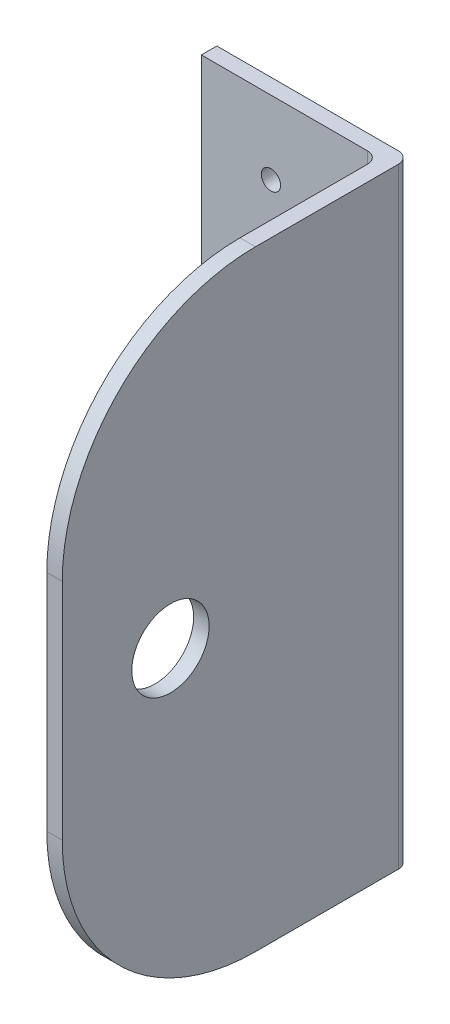
ISO-10303-21;
HEADER;
FILE_DESCRIPTION(('STEP AP214'),'2;1');
FILE_NAME('part.step','',(''),(''),'','','');
FILE_SCHEMA(('AUTOMOTIVE_DESIGN { 1 0 10303 214 1 1 1 1 }'));
ENDSEC;
DATA;
#1=APPLICATION_CONTEXT('core data for automotive mechanical design processes');
#2=APPLICATION_PROTOCOL_DEFINITION('international standard','automotive_design',2000,#1);
#3=PRODUCT_CONTEXT('',#1,'mechanical');
#4=PRODUCT('Part','Part','',(#3));
#5=PRODUCT_RELATED_PRODUCT_CATEGORY('part','',(#4));
#6=PRODUCT_DEFINITION_FORMATION('','',#4);
#7=PRODUCT_DEFINITION_CONTEXT('part definition',#1,'design');
#8=PRODUCT_DEFINITION('design','',#6,#7);
#9=PRODUCT_DEFINITION_SHAPE('','',#8);
#10=(LENGTH_UNIT() NAMED_UNIT(*) SI_UNIT(.MILLI.,.METRE.));
#11=(NAMED_UNIT(*) PLANE_ANGLE_UNIT() SI_UNIT($,.RADIAN.));
#12=(NAMED_UNIT(*) SI_UNIT($,.STERADIAN.) SOLID_ANGLE_UNIT());
#13=UNCERTAINTY_MEASURE_WITH_UNIT(LENGTH_MEASURE(1.E-05),#10,'distance_accuracy_value','');
#14=(GEOMETRIC_REPRESENTATION_CONTEXT(3) GLOBAL_UNCERTAINTY_ASSIGNED_CONTEXT((#13)) GLOBAL_UNIT_ASSIGNED_CONTEXT((#10,
#11,#12)) REPRESENTATION_CONTEXT('',''));
#15=CARTESIAN_POINT('',(0.,0.,0.));
#16=DIRECTION('',(0.,0.,1.));
#17=DIRECTION('',(1.,0.,0.));
#18=AXIS2_PLACEMENT_3D('',#15,#16,#17);
#19=CARTESIAN_POINT('',(0.,79.,0.));
#20=DIRECTION('',(0.,-1.,0.));
#21=DIRECTION('',(0.,0.,-1.));
#22=AXIS2_PLACEMENT_3D('',#19,#20,#21);
#23=PLANE('',#22);
#24=DIRECTION('',(0.,0.,-1.));
#25=VECTOR('',#24,1.);
#26=CARTESIAN_POINT('',(25.,79.,0.));
#27=LINE('',#26,#25);
#28=CARTESIAN_POINT('',(25.,79.,20.));
#29=VERTEX_POINT('',#28);
#30=CARTESIAN_POINT('',(25.,79.,1.5));
#31=VERTEX_POINT('',#30);
#32=EDGE_CURVE('E127',#29,#31,#27,.T.);
#33=ORIENTED_EDGE('',*,*,#32,.T.);
#34=CARTESIAN_POINT('',(23.5,79.,1.5));
#35=DIRECTION('',(0.,-1.,0.));
#36=DIRECTION('',(0.,0.,-1.));
#37=AXIS2_PLACEMENT_3D('',#34,#35,#36);
#38=CIRCLE('',#37,1.5);
#39=CARTESIAN_POINT('',(23.5,79.,0.));
#40=VERTEX_POINT('',#39);
#41=EDGE_CURVE('E163',#31,#40,#38,.F.);
#42=ORIENTED_EDGE('',*,*,#41,.T.);
#43=DIRECTION('',(-1.,0.,0.));
#44=VECTOR('',#43,1.);
#45=CARTESIAN_POINT('',(0.,79.,0.));
#46=LINE('',#45,#44);
#47=CARTESIAN_POINT('',(0.,79.,0.));
#48=VERTEX_POINT('',#47);
#49=EDGE_CURVE('E203',#40,#48,#46,.T.);
#50=ORIENTED_EDGE('',*,*,#49,.T.);
#51=DIRECTION('',(0.,0.,1.));
#52=VECTOR('',#51,1.);
#53=CARTESIAN_POINT('',(0.,79.,0.));
#54=LINE('',#53,#52);
#55=CARTESIAN_POINT('',(0.,79.,2.));
#56=VERTEX_POINT('',#55);
#57=EDGE_CURVE('E205',#48,#56,#54,.T.);
#58=ORIENTED_EDGE('',*,*,#57,.T.);
#59=DIRECTION('',(1.,0.,0.));
#60=VECTOR('',#59,1.);
#61=CARTESIAN_POINT('',(0.,79.,2.));
#62=LINE('',#61,#60);
#63=CARTESIAN_POINT('',(21.5,79.,2.));
#64=VERTEX_POINT('',#63);
#65=EDGE_CURVE('E207',#56,#64,#62,.T.);
#66=ORIENTED_EDGE('',*,*,#65,.T.);
#67=CARTESIAN_POINT('',(21.5,79.,3.5));
#68=DIRECTION('',(0.,-1.,0.));
#69=DIRECTION('',(0.,0.,-1.));
#70=AXIS2_PLACEMENT_3D('',#67,#68,#69);
#71=CIRCLE('',#70,1.5);
#72=CARTESIAN_POINT('',(23.,79.,3.5));
#73=VERTEX_POINT('',#72);
#74=EDGE_CURVE('E11',#64,#73,#71,.T.);
#75=ORIENTED_EDGE('',*,*,#74,.T.);
#76=DIRECTION('',(0.,0.,1.));
#77=VECTOR('',#76,1.);
#78=CARTESIAN_POINT('',(23.,79.,45.));
#79=LINE('',#78,#77);
#80=CARTESIAN_POINT('',(23.,79.,20.));
#81=VERTEX_POINT('',#80);
#82=EDGE_CURVE('E138',#73,#81,#79,.T.);
#83=ORIENTED_EDGE('',*,*,#82,.T.);
#84=DIRECTION('',(1.,0.,0.));
#85=VECTOR('',#84,1.);
#86=CARTESIAN_POINT('',(0.,79.,20.));
#87=LINE('',#86,#85);
#88=EDGE_CURVE('E151',#29,#81,#87,.F.);
#89=ORIENTED_EDGE('',*,*,#88,.F.);
#90=EDGE_LOOP('',(#33,#42,#50,#58,#66,#75,#83,#89));
#91=FACE_BOUND('',#90,.T.);
#92=ADVANCED_FACE('F32',(#91),#23,.F.);
#93=CARTESIAN_POINT('',(23.,79.,45.));
#94=DIRECTION('',(1.,0.,0.));
#95=DIRECTION('',(0.,0.,-1.));
#96=AXIS2_PLACEMENT_3D('',#93,#94,#95);
#97=PLANE('',#96);
#98=CARTESIAN_POINT('',(23.,39.5,31.));
#99=DIRECTION('',(1.,0.,0.));
#100=DIRECTION('',(0.,0.,-1.));
#101=AXIS2_PLACEMENT_3D('',#98,#99,#100);
#102=CIRCLE('',#101,5.);
#103=CARTESIAN_POINT('',(23.,39.5,26.));
#104=VERTEX_POINT('',#103);
#105=EDGE_CURVE('E199',#104,#104,#102,.T.);
#106=ORIENTED_EDGE('',*,*,#105,.T.);
#107=EDGE_LOOP('',(#106));
#108=FACE_BOUND('',#107,.T.);
#109=ORIENTED_EDGE('',*,*,#82,.F.);
#110=DIRECTION('',(0.,-1.,0.));
#111=VECTOR('',#110,1.);
#112=CARTESIAN_POINT('',(23.,0.,3.5));
#113=LINE('',#112,#111);
#114=CARTESIAN_POINT('',(23.,0.,3.5));
#115=VERTEX_POINT('',#114);
#116=EDGE_CURVE('E153',#73,#115,#113,.T.);
#117=ORIENTED_EDGE('',*,*,#116,.T.);
#118=DIRECTION('',(0.,0.,1.));
#119=VECTOR('',#118,1.);
#120=CARTESIAN_POINT('',(23.,0.,45.));
#121=LINE('',#120,#119);
#122=CARTESIAN_POINT('',(23.,0.,20.));
#123=VERTEX_POINT('',#122);
#124=EDGE_CURVE('E216',#115,#123,#121,.T.);
#125=ORIENTED_EDGE('',*,*,#124,.T.);
#126=CARTESIAN_POINT('',(23.,25.,20.));
#127=DIRECTION('',(1.,0.,0.));
#128=DIRECTION('',(0.,0.,-1.));
#129=AXIS2_PLACEMENT_3D('',#126,#127,#128);
#130=CIRCLE('',#129,25.);
#131=CARTESIAN_POINT('',(23.,25.,45.));
#132=VERTEX_POINT('',#131);
#133=EDGE_CURVE('E193',#132,#123,#130,.T.);
#134=ORIENTED_EDGE('',*,*,#133,.F.);
#135=DIRECTION('',(0.,-1.,0.));
#136=VECTOR('',#135,1.);
#137=CARTESIAN_POINT('',(23.,79.,45.));
#138=LINE('',#137,#136);
#139=CARTESIAN_POINT('',(23.,54.,45.));
#140=VERTEX_POINT('',#139);
#141=EDGE_CURVE('E134',#140,#132,#138,.T.);
#142=ORIENTED_EDGE('',*,*,#141,.F.);
#143=CARTESIAN_POINT('',(23.,54.,20.));
#144=DIRECTION('',(1.,0.,0.));
#145=DIRECTION('',(0.,0.,-1.));
#146=AXIS2_PLACEMENT_3D('',#143,#144,#145);
#147=CIRCLE('',#146,25.);
#148=EDGE_CURVE('E118',#140,#81,#147,.F.);
#149=ORIENTED_EDGE('',*,*,#148,.T.);
#150=EDGE_LOOP('',(#109,#117,#125,#134,#142,#149));
#151=FACE_BOUND('',#150,.T.);
#152=ADVANCED_FACE('F242',(#108,#151),#97,.F.);
#153=CARTESIAN_POINT('',(25.,79.,0.));
#154=DIRECTION('',(-1.,0.,0.));
#155=DIRECTION('',(0.,0.,1.));
#156=AXIS2_PLACEMENT_3D('',#153,#154,#155);
#157=PLANE('',#156);
#158=CARTESIAN_POINT('',(25.,39.5,31.));
#159=DIRECTION('',(1.,0.,0.));
#160=DIRECTION('',(0.,0.,-1.));
#161=AXIS2_PLACEMENT_3D('',#158,#159,#160);
#162=CIRCLE('',#161,5.);
#163=CARTESIAN_POINT('',(25.,39.5,26.));
#164=VERTEX_POINT('',#163);
#165=EDGE_CURVE('E196',#164,#164,#162,.T.);
#166=ORIENTED_EDGE('',*,*,#165,.F.);
#167=EDGE_LOOP('',(#166));
#168=FACE_BOUND('',#167,.T.);
#169=DIRECTION('',(0.,0.,-1.));
#170=VECTOR('',#169,1.);
#171=CARTESIAN_POINT('',(25.,0.,0.));
#172=LINE('',#171,#170);
#173=CARTESIAN_POINT('',(25.,0.,20.));
#174=VERTEX_POINT('',#173);
#175=CARTESIAN_POINT('',(25.,0.,1.5));
#176=VERTEX_POINT('',#175);
#177=EDGE_CURVE('E141',#174,#176,#172,.T.);
#178=ORIENTED_EDGE('',*,*,#177,.T.);
#179=DIRECTION('',(0.,-1.,0.));
#180=VECTOR('',#179,1.);
#181=CARTESIAN_POINT('',(25.,79.,1.5));
#182=LINE('',#181,#180);
#183=EDGE_CURVE('E49',#176,#31,#182,.F.);
#184=ORIENTED_EDGE('',*,*,#183,.T.);
#185=ORIENTED_EDGE('',*,*,#32,.F.);
#186=CARTESIAN_POINT('',(25.,54.,20.));
#187=DIRECTION('',(1.,0.,0.));
#188=DIRECTION('',(0.,0.,-1.));
#189=AXIS2_PLACEMENT_3D('',#186,#187,#188);
#190=CIRCLE('',#189,25.);
#191=CARTESIAN_POINT('',(25.,54.,45.));
#192=VERTEX_POINT('',#191);
#193=EDGE_CURVE('E115',#192,#29,#190,.F.);
#194=ORIENTED_EDGE('',*,*,#193,.F.);
#195=DIRECTION('',(0.,-1.,0.));
#196=VECTOR('',#195,1.);
#197=CARTESIAN_POINT('',(25.,79.,45.));
#198=LINE('',#197,#196);
#199=CARTESIAN_POINT('',(25.,25.,45.));
#200=VERTEX_POINT('',#199);
#201=EDGE_CURVE('E125',#192,#200,#198,.T.);
#202=ORIENTED_EDGE('',*,*,#201,.T.);
#203=CARTESIAN_POINT('',(25.,25.,20.));
#204=DIRECTION('',(1.,0.,0.));
#205=DIRECTION('',(0.,0.,-1.));
#206=AXIS2_PLACEMENT_3D('',#203,#204,#205);
#207=CIRCLE('',#206,25.);
#208=EDGE_CURVE('E190',#200,#174,#207,.T.);
#209=ORIENTED_EDGE('',*,*,#208,.T.);
#210=EDGE_LOOP('',(#178,#184,#185,#194,#202,#209));
#211=FACE_BOUND('',#210,.T.);
#212=ADVANCED_FACE('F123',(#168,#211),#157,.F.);
#213=CARTESIAN_POINT('',(0.,79.,0.));
#214=DIRECTION('',(0.,0.,1.));
#215=DIRECTION('',(1.,0.,0.));
#216=AXIS2_PLACEMENT_3D('',#213,#214,#215);
#217=PLANE('',#216);
#218=CARTESIAN_POINT('',(18.,9.5,0.));
#219=DIRECTION('',(0.,0.,-1.));
#220=DIRECTION('',(-1.,0.,0.));
#221=AXIS2_PLACEMENT_3D('',#218,#219,#220);
#222=CIRCLE('',#221,1.25);
#223=CARTESIAN_POINT('',(16.75,9.5,0.));
#224=VERTEX_POINT('',#223);
#225=EDGE_CURVE('E184',#224,#224,#222,.T.);
#226=ORIENTED_EDGE('',*,*,#225,.F.);
#227=EDGE_LOOP('',(#226));
#228=FACE_BOUND('',#227,.T.);
#229=CARTESIAN_POINT('',(9.,9.5,0.));
#230=DIRECTION('',(0.,0.,-1.));
#231=DIRECTION('',(-1.,0.,0.));
#232=AXIS2_PLACEMENT_3D('',#229,#230,#231);
#233=CIRCLE('',#232,1.25);
#234=CARTESIAN_POINT('',(7.75,9.5,0.));
#235=VERTEX_POINT('',#234);
#236=EDGE_CURVE('E174',#235,#235,#233,.T.);
#237=ORIENTED_EDGE('',*,*,#236,.F.);
#238=EDGE_LOOP('',(#237));
#239=FACE_BOUND('',#238,.T.);
#240=CARTESIAN_POINT('',(9.,69.5,0.));
#241=DIRECTION('',(0.,0.,-1.));
#242=DIRECTION('',(-1.,0.,0.));
#243=AXIS2_PLACEMENT_3D('',#240,#241,#242);
#244=CIRCLE('',#243,1.25);
#245=CARTESIAN_POINT('',(7.75,69.5,0.));
#246=VERTEX_POINT('',#245);
#247=EDGE_CURVE('E171',#246,#246,#244,.T.);
#248=ORIENTED_EDGE('',*,*,#247,.F.);
#249=EDGE_LOOP('',(#248));
#250=FACE_BOUND('',#249,.T.);
#251=CARTESIAN_POINT('',(18.,69.5,0.));
#252=DIRECTION('',(0.,0.,-1.));
#253=DIRECTION('',(-1.,0.,0.));
#254=AXIS2_PLACEMENT_3D('',#251,#252,#253);
#255=CIRCLE('',#254,1.25);
#256=CARTESIAN_POINT('',(16.75,69.5,0.));
#257=VERTEX_POINT('',#256);
#258=EDGE_CURVE('E168',#257,#257,#255,.T.);
#259=ORIENTED_EDGE('',*,*,#258,.F.);
#260=EDGE_LOOP('',(#259));
#261=FACE_BOUND('',#260,.T.);
#262=ORIENTED_EDGE('',*,*,#49,.F.);
#263=DIRECTION('',(0.,-1.,0.));
#264=VECTOR('',#263,1.);
#265=CARTESIAN_POINT('',(23.5,79.,0.));
#266=LINE('',#265,#264);
#267=CARTESIAN_POINT('',(23.5,0.,0.));
#268=VERTEX_POINT('',#267);
#269=EDGE_CURVE('E158',#40,#268,#266,.T.);
#270=ORIENTED_EDGE('',*,*,#269,.T.);
#271=DIRECTION('',(-1.,0.,0.));
#272=VECTOR('',#271,1.);
#273=CARTESIAN_POINT('',(0.,0.,0.));
#274=LINE('',#273,#272);
#275=CARTESIAN_POINT('',(0.,0.,0.));
#276=VERTEX_POINT('',#275);
#277=EDGE_CURVE('E202',#268,#276,#274,.T.);
#278=ORIENTED_EDGE('',*,*,#277,.T.);
#279=DIRECTION('',(0.,-1.,0.));
#280=VECTOR('',#279,1.);
#281=CARTESIAN_POINT('',(0.,79.,0.));
#282=LINE('',#281,#280);
#283=EDGE_CURVE('E146',#48,#276,#282,.T.);
#284=ORIENTED_EDGE('',*,*,#283,.F.);
#285=EDGE_LOOP('',(#262,#270,#278,#284));
#286=FACE_BOUND('',#285,.T.);
#287=ADVANCED_FACE('F229',(#228,#239,#250,#261,#286),#217,.F.);
#288=CARTESIAN_POINT('',(0.,79.,0.));
#289=DIRECTION('',(1.,0.,0.));
#290=DIRECTION('',(0.,0.,-1.));
#291=AXIS2_PLACEMENT_3D('',#288,#289,#290);
#292=PLANE('',#291);
#293=DIRECTION('',(0.,0.,1.));
#294=VECTOR('',#293,1.);
#295=CARTESIAN_POINT('',(0.,0.,0.));
#296=LINE('',#295,#294);
#297=CARTESIAN_POINT('',(0.,0.,2.));
#298=VERTEX_POINT('',#297);
#299=EDGE_CURVE('E212',#276,#298,#296,.T.);
#300=ORIENTED_EDGE('',*,*,#299,.T.);
#301=DIRECTION('',(0.,-1.,0.));
#302=VECTOR('',#301,1.);
#303=CARTESIAN_POINT('',(0.,79.,2.));
#304=LINE('',#303,#302);
#305=EDGE_CURVE('E136',#56,#298,#304,.T.);
#306=ORIENTED_EDGE('',*,*,#305,.F.);
#307=ORIENTED_EDGE('',*,*,#57,.F.);
#308=ORIENTED_EDGE('',*,*,#283,.T.);
#309=EDGE_LOOP('',(#300,#306,#307,#308));
#310=FACE_BOUND('',#309,.T.);
#311=ADVANCED_FACE('F232',(#310),#292,.F.);
#312=CARTESIAN_POINT('',(0.,79.,2.));
#313=DIRECTION('',(0.,0.,-1.));
#314=DIRECTION('',(-1.,0.,0.));
#315=AXIS2_PLACEMENT_3D('',#312,#313,#314);
#316=PLANE('',#315);
#317=CARTESIAN_POINT('',(18.,9.5,2.));
#318=DIRECTION('',(0.,0.,-1.));
#319=DIRECTION('',(-1.,0.,0.));
#320=AXIS2_PLACEMENT_3D('',#317,#318,#319);
#321=CIRCLE('',#320,1.25);
#322=CARTESIAN_POINT('',(16.75,9.5,2.00000000000001));
#323=VERTEX_POINT('',#322);
#324=EDGE_CURVE('E36',#323,#323,#321,.T.);
#325=ORIENTED_EDGE('',*,*,#324,.T.);
#326=EDGE_LOOP('',(#325));
#327=FACE_BOUND('',#326,.T.);
#328=CARTESIAN_POINT('',(9.,9.5,2.));
#329=DIRECTION('',(0.,0.,-1.));
#330=DIRECTION('',(-1.,0.,0.));
#331=AXIS2_PLACEMENT_3D('',#328,#329,#330);
#332=CIRCLE('',#331,1.25);
#333=CARTESIAN_POINT('',(7.75,9.5,2.00000000000001));
#334=VERTEX_POINT('',#333);
#335=EDGE_CURVE('E172',#334,#334,#332,.T.);
#336=ORIENTED_EDGE('',*,*,#335,.T.);
#337=EDGE_LOOP('',(#336));
#338=FACE_BOUND('',#337,.T.);
#339=CARTESIAN_POINT('',(9.,69.5,2.));
#340=DIRECTION('',(0.,0.,-1.));
#341=DIRECTION('',(-1.,0.,0.));
#342=AXIS2_PLACEMENT_3D('',#339,#340,#341);
#343=CIRCLE('',#342,1.25);
#344=CARTESIAN_POINT('',(7.75,69.5,2.00000000000001));
#345=VERTEX_POINT('',#344);
#346=EDGE_CURVE('E169',#345,#345,#343,.T.);
#347=ORIENTED_EDGE('',*,*,#346,.T.);
#348=EDGE_LOOP('',(#347));
#349=FACE_BOUND('',#348,.T.);
#350=CARTESIAN_POINT('',(18.,69.5,2.));
#351=DIRECTION('',(0.,0.,-1.));
#352=DIRECTION('',(-1.,0.,0.));
#353=AXIS2_PLACEMENT_3D('',#350,#351,#352);
#354=CIRCLE('',#353,1.25);
#355=CARTESIAN_POINT('',(16.75,69.5,2.00000000000001));
#356=VERTEX_POINT('',#355);
#357=EDGE_CURVE('E128',#356,#356,#354,.T.);
#358=ORIENTED_EDGE('',*,*,#357,.T.);
#359=EDGE_LOOP('',(#358));
#360=FACE_BOUND('',#359,.T.);
#361=DIRECTION('',(1.,0.,0.));
#362=VECTOR('',#361,1.);
#363=CARTESIAN_POINT('',(0.,0.,2.));
#364=LINE('',#363,#362);
#365=CARTESIAN_POINT('',(21.5,0.,2.));
#366=VERTEX_POINT('',#365);
#367=EDGE_CURVE('E214',#298,#366,#364,.T.);
#368=ORIENTED_EDGE('',*,*,#367,.T.);
#369=DIRECTION('',(0.,-1.,0.));
#370=VECTOR('',#369,1.);
#371=CARTESIAN_POINT('',(21.5,79.,2.));
#372=LINE('',#371,#370);
#373=EDGE_CURVE('E156',#366,#64,#372,.F.);
#374=ORIENTED_EDGE('',*,*,#373,.T.);
#375=ORIENTED_EDGE('',*,*,#65,.F.);
#376=ORIENTED_EDGE('',*,*,#305,.T.);
#377=EDGE_LOOP('',(#368,#374,#375,#376));
#378=FACE_BOUND('',#377,.T.);
#379=ADVANCED_FACE('F271',(#327,#338,#349,#360,#378),#316,.F.);
#380=CARTESIAN_POINT('',(25.,79.,45.));
#381=DIRECTION('',(0.,0.,-1.));
#382=DIRECTION('',(-1.,0.,0.));
#383=AXIS2_PLACEMENT_3D('',#380,#381,#382);
#384=PLANE('',#383);
#385=ORIENTED_EDGE('',*,*,#201,.F.);
#386=DIRECTION('',(1.,0.,0.));
#387=VECTOR('',#386,1.);
#388=CARTESIAN_POINT('',(0.,54.,45.));
#389=LINE('',#388,#387);
#390=EDGE_CURVE('E111',#140,#192,#389,.T.);
#391=ORIENTED_EDGE('',*,*,#390,.F.);
#392=ORIENTED_EDGE('',*,*,#141,.T.);
#393=DIRECTION('',(1.,0.,0.));
#394=VECTOR('',#393,1.);
#395=CARTESIAN_POINT('',(0.,25.,45.));
#396=LINE('',#395,#394);
#397=EDGE_CURVE('E133',#132,#200,#396,.T.);
#398=ORIENTED_EDGE('',*,*,#397,.T.);
#399=EDGE_LOOP('',(#385,#391,#392,#398));
#400=FACE_BOUND('',#399,.T.);
#401=ADVANCED_FACE('F131',(#400),#384,.F.);
#402=CARTESIAN_POINT('',(0.,0.,0.));
#403=DIRECTION('',(0.,-1.,0.));
#404=DIRECTION('',(0.,0.,-1.));
#405=AXIS2_PLACEMENT_3D('',#402,#403,#404);
#406=PLANE('',#405);
#407=ORIENTED_EDGE('',*,*,#277,.F.);
#408=CARTESIAN_POINT('',(23.5,0.,1.5));
#409=DIRECTION('',(0.,-1.,0.));
#410=DIRECTION('',(0.,0.,-1.));
#411=AXIS2_PLACEMENT_3D('',#408,#409,#410);
#412=CIRCLE('',#411,1.5);
#413=EDGE_CURVE('E57',#268,#176,#412,.T.);
#414=ORIENTED_EDGE('',*,*,#413,.T.);
#415=ORIENTED_EDGE('',*,*,#177,.F.);
#416=DIRECTION('',(1.,0.,0.));
#417=VECTOR('',#416,1.);
#418=CARTESIAN_POINT('',(0.,0.,20.));
#419=LINE('',#418,#417);
#420=EDGE_CURVE('E149',#123,#174,#419,.T.);
#421=ORIENTED_EDGE('',*,*,#420,.F.);
#422=ORIENTED_EDGE('',*,*,#124,.F.);
#423=CARTESIAN_POINT('',(21.5,0.,3.5));
#424=DIRECTION('',(0.,-1.,0.));
#425=DIRECTION('',(0.,0.,-1.));
#426=AXIS2_PLACEMENT_3D('',#423,#424,#425);
#427=CIRCLE('',#426,1.5);
#428=EDGE_CURVE('E41',#115,#366,#427,.F.);
#429=ORIENTED_EDGE('',*,*,#428,.T.);
#430=ORIENTED_EDGE('',*,*,#367,.F.);
#431=ORIENTED_EDGE('',*,*,#299,.F.);
#432=EDGE_LOOP('',(#407,#414,#415,#421,#422,#429,#430,#431));
#433=FACE_BOUND('',#432,.T.);
#434=ADVANCED_FACE('F243',(#433),#406,.T.);
#435=CARTESIAN_POINT('',(0.,39.5,31.));
#436=DIRECTION('',(1.,0.,0.));
#437=DIRECTION('',(0.,0.,-1.));
#438=AXIS2_PLACEMENT_3D('',#435,#436,#437);
#439=CYLINDRICAL_SURFACE('',#438,5.);
#440=ORIENTED_EDGE('',*,*,#165,.T.);
#441=EDGE_LOOP('',(#440));
#442=FACE_BOUND('',#441,.T.);
#443=ORIENTED_EDGE('',*,*,#105,.F.);
#444=EDGE_LOOP('',(#443));
#445=FACE_BOUND('',#444,.T.);
#446=ADVANCED_FACE('F248',(#442,#445),#439,.F.);
#447=CARTESIAN_POINT('',(0.,25.,20.));
#448=DIRECTION('',(1.,0.,0.));
#449=DIRECTION('',(0.,0.,-1.));
#450=AXIS2_PLACEMENT_3D('',#447,#448,#449);
#451=CYLINDRICAL_SURFACE('',#450,25.);
#452=ORIENTED_EDGE('',*,*,#133,.T.);
#453=ORIENTED_EDGE('',*,*,#420,.T.);
#454=ORIENTED_EDGE('',*,*,#208,.F.);
#455=ORIENTED_EDGE('',*,*,#397,.F.);
#456=EDGE_LOOP('',(#452,#453,#454,#455));
#457=FACE_BOUND('',#456,.T.);
#458=ADVANCED_FACE('F246',(#457),#451,.T.);
#459=CARTESIAN_POINT('',(0.,54.,20.));
#460=DIRECTION('',(1.,0.,0.));
#461=DIRECTION('',(0.,0.,-1.));
#462=AXIS2_PLACEMENT_3D('',#459,#460,#461);
#463=CYLINDRICAL_SURFACE('',#462,25.);
#464=ORIENTED_EDGE('',*,*,#390,.T.);
#465=ORIENTED_EDGE('',*,*,#193,.T.);
#466=ORIENTED_EDGE('',*,*,#88,.T.);
#467=ORIENTED_EDGE('',*,*,#148,.F.);
#468=EDGE_LOOP('',(#464,#465,#466,#467));
#469=FACE_BOUND('',#468,.T.);
#470=ADVANCED_FACE('F113',(#469),#463,.T.);
#471=CARTESIAN_POINT('',(21.5,79.,3.5));
#472=DIRECTION('',(0.,1.,0.));
#473=DIRECTION('',(0.,0.,1.));
#474=AXIS2_PLACEMENT_3D('',#471,#472,#473);
#475=CYLINDRICAL_SURFACE('',#474,1.5);
#476=ORIENTED_EDGE('',*,*,#74,.F.);
#477=ORIENTED_EDGE('',*,*,#373,.F.);
#478=ORIENTED_EDGE('',*,*,#428,.F.);
#479=ORIENTED_EDGE('',*,*,#116,.F.);
#480=EDGE_LOOP('',(#476,#477,#478,#479));
#481=FACE_BOUND('',#480,.T.);
#482=ADVANCED_FACE('F241',(#481),#475,.F.);
#483=CARTESIAN_POINT('',(23.5,79.,1.5));
#484=DIRECTION('',(0.,-1.,0.));
#485=DIRECTION('',(0.,0.,-1.));
#486=AXIS2_PLACEMENT_3D('',#483,#484,#485);
#487=CYLINDRICAL_SURFACE('',#486,1.5);
#488=ORIENTED_EDGE('',*,*,#41,.F.);
#489=ORIENTED_EDGE('',*,*,#183,.F.);
#490=ORIENTED_EDGE('',*,*,#413,.F.);
#491=ORIENTED_EDGE('',*,*,#269,.F.);
#492=EDGE_LOOP('',(#488,#489,#490,#491));
#493=FACE_BOUND('',#492,.T.);
#494=ADVANCED_FACE('F34',(#493),#487,.T.);
#495=CARTESIAN_POINT('',(18.,69.5,45.));
#496=DIRECTION('',(0.,0.,-1.));
#497=DIRECTION('',(-1.,0.,0.));
#498=AXIS2_PLACEMENT_3D('',#495,#496,#497);
#499=CYLINDRICAL_SURFACE('',#498,1.25);
#500=CARTESIAN_POINT('',(16.75,69.5,0.));
#501=CARTESIAN_POINT('',(16.75,69.5,0.0208333333333403));
#502=CARTESIAN_POINT('',(16.75,69.5,0.0416666666666736));
#503=CARTESIAN_POINT('',(16.75,69.5,0.0833333333333404));
#504=CARTESIAN_POINT('',(16.75,69.5,0.104166666666674));
#505=CARTESIAN_POINT('',(16.75,69.5,0.14583333333334));
#506=CARTESIAN_POINT('',(16.75,69.5,0.166666666666674));
#507=CARTESIAN_POINT('',(16.75,69.5,0.20833333333334));
#508=CARTESIAN_POINT('',(16.75,69.5,0.229166666666674));
#509=CARTESIAN_POINT('',(16.75,69.5,0.270833333333341));
#510=CARTESIAN_POINT('',(16.75,69.5,0.291666666666674));
#511=CARTESIAN_POINT('',(16.75,69.5,0.333333333333341));
#512=CARTESIAN_POINT('',(16.75,69.5,0.354166666666674));
#513=CARTESIAN_POINT('',(16.75,69.5,0.395833333333341));
#514=CARTESIAN_POINT('',(16.75,69.5,0.416666666666674));
#515=CARTESIAN_POINT('',(16.75,69.5,0.458333333333341));
#516=CARTESIAN_POINT('',(16.75,69.5,0.479166666666674));
#517=CARTESIAN_POINT('',(16.75,69.5,0.520833333333341));
#518=CARTESIAN_POINT('',(16.75,69.5,0.541666666666674));
#519=CARTESIAN_POINT('',(16.75,69.5,0.583333333333341));
#520=CARTESIAN_POINT('',(16.75,69.5,0.604166666666674));
#521=CARTESIAN_POINT('',(16.75,69.5,0.645833333333341));
#522=CARTESIAN_POINT('',(16.75,69.5,0.666666666666674));
#523=CARTESIAN_POINT('',(16.75,69.5,0.708333333333341));
#524=CARTESIAN_POINT('',(16.75,69.5,0.729166666666674));
#525=CARTESIAN_POINT('',(16.75,69.5,0.770833333333341));
#526=CARTESIAN_POINT('',(16.75,69.5,0.791666666666674));
#527=CARTESIAN_POINT('',(16.75,69.5,0.833333333333341));
#528=CARTESIAN_POINT('',(16.75,69.5,0.854166666666674));
#529=CARTESIAN_POINT('',(16.75,69.5,0.895833333333341));
#530=CARTESIAN_POINT('',(16.75,69.5,0.916666666666674));
#531=CARTESIAN_POINT('',(16.75,69.5,0.958333333333341));
#532=CARTESIAN_POINT('',(16.75,69.5,0.979166666666674));
#533=CARTESIAN_POINT('',(16.75,69.5,1.02083333333334));
#534=CARTESIAN_POINT('',(16.75,69.5,1.04166666666667));
#535=CARTESIAN_POINT('',(16.75,69.5,1.08333333333334));
#536=CARTESIAN_POINT('',(16.75,69.5,1.10416666666667));
#537=CARTESIAN_POINT('',(16.75,69.5,1.14583333333334));
#538=CARTESIAN_POINT('',(16.75,69.5,1.16666666666667));
#539=CARTESIAN_POINT('',(16.75,69.5,1.20833333333334));
#540=CARTESIAN_POINT('',(16.75,69.5,1.22916666666667));
#541=CARTESIAN_POINT('',(16.75,69.5,1.27083333333334));
#542=CARTESIAN_POINT('',(16.75,69.5,1.29166666666667));
#543=CARTESIAN_POINT('',(16.75,69.5,1.33333333333334));
#544=CARTESIAN_POINT('',(16.75,69.5,1.35416666666667));
#545=CARTESIAN_POINT('',(16.75,69.5,1.39583333333334));
#546=CARTESIAN_POINT('',(16.75,69.5,1.41666666666667));
#547=CARTESIAN_POINT('',(16.75,69.5,1.45833333333334));
#548=CARTESIAN_POINT('',(16.75,69.5,1.47916666666667));
#549=CARTESIAN_POINT('',(16.75,69.5,1.52083333333334));
#550=CARTESIAN_POINT('',(16.75,69.5,1.54166666666667));
#551=CARTESIAN_POINT('',(16.75,69.5,1.58333333333334));
#552=CARTESIAN_POINT('',(16.75,69.5,1.60416666666667));
#553=CARTESIAN_POINT('',(16.75,69.5,1.64583333333334));
#554=CARTESIAN_POINT('',(16.75,69.5,1.66666666666667));
#555=CARTESIAN_POINT('',(16.75,69.5,1.70833333333334));
#556=CARTESIAN_POINT('',(16.75,69.5,1.72916666666668));
#557=CARTESIAN_POINT('',(16.75,69.5,1.77083333333334));
#558=CARTESIAN_POINT('',(16.75,69.5,1.79166666666668));
#559=CARTESIAN_POINT('',(16.75,69.5,1.83333333333334));
#560=CARTESIAN_POINT('',(16.75,69.5,1.85416666666668));
#561=CARTESIAN_POINT('',(16.75,69.5,1.89583333333334));
#562=CARTESIAN_POINT('',(16.75,69.5,1.91666666666668));
#563=CARTESIAN_POINT('',(16.75,69.5,1.95833333333334));
#564=CARTESIAN_POINT('',(16.75,69.5,1.97916666666668));
#565=CARTESIAN_POINT('',(16.75,69.5,2.00000000000001));
#566=B_SPLINE_CURVE_WITH_KNOTS('',3,(#500,#501,#502,#503,#504,#505,#506,#507,#508,#509,#510,
#511,#512,#513,#514,#515,#516,#517,#518,#519,#520,#521,#522,#523,#524,#525,#526,#527,#528,#529,
#530,#531,#532,#533,#534,#535,#536,#537,#538,#539,#540,#541,#542,#543,#544,#545,#546,#547,#548,
#549,#550,#551,#552,#553,#554,#555,#556,#557,#558,#559,#560,#561,#562,#563,#564,#565),
.UNSPECIFIED.,.F.,.F.,(4,2,2,2,2,2,2,2,2,2,2,2,2,2,2,2,2,2,2,2,2,2,2,2,2,2,2,2,2,2,2,2,4),(0.,
0.0625000000000001,0.125,0.1875,0.25,0.3125,0.375,0.4375,0.5,0.5625,0.625000000000001,
0.687500000000001,0.750000000000001,0.812500000000001,0.875000000000001,0.937500000000001,1.,
1.0625,1.125,1.1875,1.25,1.3125,1.375,1.4375,1.5,1.5625,1.625,1.6875,1.75,1.8125,1.875,1.9375,
2.),.UNSPECIFIED.);
#567=EDGE_CURVE('BSEAM284',#257,#356,#566,.T.);
#568=ORIENTED_EDGE('',*,*,#258,.T.);
#569=ORIENTED_EDGE('',*,*,#357,.F.);
#570=ORIENTED_EDGE('',*,*,#567,.T.);
#571=ORIENTED_EDGE('',*,*,#567,.F.);
#572=EDGE_LOOP('',(#568,#570,#569,#571));
#573=FACE_BOUND('',#572,.T.);
#574=ADVANCED_FACE('F284',(#573),#499,.F.);
#575=CARTESIAN_POINT('',(9.,69.5,45.));
#576=DIRECTION('',(0.,0.,-1.));
#577=DIRECTION('',(-1.,0.,0.));
#578=AXIS2_PLACEMENT_3D('',#575,#576,#577);
#579=CYLINDRICAL_SURFACE('',#578,1.25);
#580=CARTESIAN_POINT('',(7.75,69.5,0.));
#581=CARTESIAN_POINT('',(7.75,69.5,0.0208333333333403));
#582=CARTESIAN_POINT('',(7.75,69.5,0.0416666666666736));
#583=CARTESIAN_POINT('',(7.75,69.5,0.0833333333333404));
#584=CARTESIAN_POINT('',(7.75,69.5,0.104166666666674));
#585=CARTESIAN_POINT('',(7.75,69.5,0.14583333333334));
#586=CARTESIAN_POINT('',(7.75,69.5,0.166666666666674));
#587=CARTESIAN_POINT('',(7.75,69.5,0.20833333333334));
#588=CARTESIAN_POINT('',(7.75,69.5,0.229166666666674));
#589=CARTESIAN_POINT('',(7.75,69.5,0.270833333333341));
#590=CARTESIAN_POINT('',(7.75,69.5,0.291666666666674));
#591=CARTESIAN_POINT('',(7.75,69.5,0.333333333333341));
#592=CARTESIAN_POINT('',(7.75,69.5,0.354166666666674));
#593=CARTESIAN_POINT('',(7.75,69.5,0.395833333333341));
#594=CARTESIAN_POINT('',(7.75,69.5,0.416666666666674));
#595=CARTESIAN_POINT('',(7.75,69.5,0.458333333333341));
#596=CARTESIAN_POINT('',(7.75,69.5,0.479166666666674));
#597=CARTESIAN_POINT('',(7.75,69.5,0.520833333333341));
#598=CARTESIAN_POINT('',(7.75,69.5,0.541666666666674));
#599=CARTESIAN_POINT('',(7.75,69.5,0.583333333333341));
#600=CARTESIAN_POINT('',(7.75,69.5,0.604166666666674));
#601=CARTESIAN_POINT('',(7.75,69.5,0.645833333333341));
#602=CARTESIAN_POINT('',(7.75,69.5,0.666666666666674));
#603=CARTESIAN_POINT('',(7.75,69.5,0.708333333333341));
#604=CARTESIAN_POINT('',(7.75,69.5,0.729166666666674));
#605=CARTESIAN_POINT('',(7.75,69.5,0.770833333333341));
#606=CARTESIAN_POINT('',(7.75,69.5,0.791666666666674));
#607=CARTESIAN_POINT('',(7.75,69.5,0.833333333333341));
#608=CARTESIAN_POINT('',(7.75,69.5,0.854166666666674));
#609=CARTESIAN_POINT('',(7.75,69.5,0.895833333333341));
#610=CARTESIAN_POINT('',(7.75,69.5,0.916666666666674));
#611=CARTESIAN_POINT('',(7.75,69.5,0.958333333333341));
#612=CARTESIAN_POINT('',(7.75,69.5,0.979166666666674));
#613=CARTESIAN_POINT('',(7.75,69.5,1.02083333333334));
#614=CARTESIAN_POINT('',(7.75,69.5,1.04166666666667));
#615=CARTESIAN_POINT('',(7.75,69.5,1.08333333333334));
#616=CARTESIAN_POINT('',(7.75,69.5,1.10416666666667));
#617=CARTESIAN_POINT('',(7.75,69.5,1.14583333333334));
#618=CARTESIAN_POINT('',(7.75,69.5,1.16666666666667));
#619=CARTESIAN_POINT('',(7.75,69.5,1.20833333333334));
#620=CARTESIAN_POINT('',(7.75,69.5,1.22916666666667));
#621=CARTESIAN_POINT('',(7.75,69.5,1.27083333333334));
#622=CARTESIAN_POINT('',(7.75,69.5,1.29166666666667));
#623=CARTESIAN_POINT('',(7.75,69.5,1.33333333333334));
#624=CARTESIAN_POINT('',(7.75,69.5,1.35416666666667));
#625=CARTESIAN_POINT('',(7.75,69.5,1.39583333333334));
#626=CARTESIAN_POINT('',(7.75,69.5,1.41666666666667));
#627=CARTESIAN_POINT('',(7.75,69.5,1.45833333333334));
#628=CARTESIAN_POINT('',(7.75,69.5,1.47916666666667));
#629=CARTESIAN_POINT('',(7.75,69.5,1.52083333333334));
#630=CARTESIAN_POINT('',(7.75,69.5,1.54166666666667));
#631=CARTESIAN_POINT('',(7.75,69.5,1.58333333333334));
#632=CARTESIAN_POINT('',(7.75,69.5,1.60416666666667));
#633=CARTESIAN_POINT('',(7.75,69.5,1.64583333333334));
#634=CARTESIAN_POINT('',(7.75,69.5,1.66666666666667));
#635=CARTESIAN_POINT('',(7.75,69.5,1.70833333333334));
#636=CARTESIAN_POINT('',(7.75,69.5,1.72916666666668));
#637=CARTESIAN_POINT('',(7.75,69.5,1.77083333333334));
#638=CARTESIAN_POINT('',(7.75,69.5,1.79166666666668));
#639=CARTESIAN_POINT('',(7.75,69.5,1.83333333333334));
#640=CARTESIAN_POINT('',(7.75,69.5,1.85416666666668));
#641=CARTESIAN_POINT('',(7.75,69.5,1.89583333333334));
#642=CARTESIAN_POINT('',(7.75,69.5,1.91666666666668));
#643=CARTESIAN_POINT('',(7.75,69.5,1.95833333333334));
#644=CARTESIAN_POINT('',(7.75,69.5,1.97916666666668));
#645=CARTESIAN_POINT('',(7.75,69.5,2.00000000000001));
#646=B_SPLINE_CURVE_WITH_KNOTS('',3,(#580,#581,#582,#583,#584,#585,#586,#587,#588,#589,#590,
#591,#592,#593,#594,#595,#596,#597,#598,#599,#600,#601,#602,#603,#604,#605,#606,#607,#608,#609,
#610,#611,#612,#613,#614,#615,#616,#617,#618,#619,#620,#621,#622,#623,#624,#625,#626,#627,#628,
#629,#630,#631,#632,#633,#634,#635,#636,#637,#638,#639,#640,#641,#642,#643,#644,#645),
.UNSPECIFIED.,.F.,.F.,(4,2,2,2,2,2,2,2,2,2,2,2,2,2,2,2,2,2,2,2,2,2,2,2,2,2,2,2,2,2,2,2,4),(0.,
0.0625000000000001,0.125,0.1875,0.25,0.3125,0.375,0.4375,0.5,0.5625,0.625000000000001,
0.687500000000001,0.750000000000001,0.812500000000001,0.875000000000001,0.937500000000001,1.,
1.0625,1.125,1.1875,1.25,1.3125,1.375,1.4375,1.5,1.5625,1.625,1.6875,1.75,1.8125,1.875,1.9375,
2.),.UNSPECIFIED.);
#647=EDGE_CURVE('BSEAM288',#246,#345,#646,.T.);
#648=ORIENTED_EDGE('',*,*,#247,.T.);
#649=ORIENTED_EDGE('',*,*,#346,.F.);
#650=ORIENTED_EDGE('',*,*,#647,.T.);
#651=ORIENTED_EDGE('',*,*,#647,.F.);
#652=EDGE_LOOP('',(#648,#650,#649,#651));
#653=FACE_BOUND('',#652,.T.);
#654=ADVANCED_FACE('F288',(#653),#579,.F.);
#655=CARTESIAN_POINT('',(9.,9.5,45.));
#656=DIRECTION('',(0.,0.,-1.));
#657=DIRECTION('',(-1.,0.,0.));
#658=AXIS2_PLACEMENT_3D('',#655,#656,#657);
#659=CYLINDRICAL_SURFACE('',#658,1.25);
#660=CARTESIAN_POINT('',(7.75,9.5,0.));
#661=CARTESIAN_POINT('',(7.75,9.5,0.0208333333333403));
#662=CARTESIAN_POINT('',(7.75,9.5,0.0416666666666736));
#663=CARTESIAN_POINT('',(7.75,9.5,0.0833333333333404));
#664=CARTESIAN_POINT('',(7.75,9.5,0.104166666666674));
#665=CARTESIAN_POINT('',(7.75,9.5,0.14583333333334));
#666=CARTESIAN_POINT('',(7.75,9.5,0.166666666666674));
#667=CARTESIAN_POINT('',(7.75,9.5,0.20833333333334));
#668=CARTESIAN_POINT('',(7.75,9.5,0.229166666666674));
#669=CARTESIAN_POINT('',(7.75,9.5,0.270833333333341));
#670=CARTESIAN_POINT('',(7.75,9.5,0.291666666666674));
#671=CARTESIAN_POINT('',(7.75,9.5,0.333333333333341));
#672=CARTESIAN_POINT('',(7.75,9.5,0.354166666666674));
#673=CARTESIAN_POINT('',(7.75,9.5,0.395833333333341));
#674=CARTESIAN_POINT('',(7.75,9.5,0.416666666666674));
#675=CARTESIAN_POINT('',(7.75,9.5,0.458333333333341));
#676=CARTESIAN_POINT('',(7.75,9.5,0.479166666666674));
#677=CARTESIAN_POINT('',(7.75,9.5,0.520833333333341));
#678=CARTESIAN_POINT('',(7.75,9.5,0.541666666666674));
#679=CARTESIAN_POINT('',(7.75,9.5,0.583333333333341));
#680=CARTESIAN_POINT('',(7.75,9.5,0.604166666666674));
#681=CARTESIAN_POINT('',(7.75,9.5,0.645833333333341));
#682=CARTESIAN_POINT('',(7.75,9.5,0.666666666666674));
#683=CARTESIAN_POINT('',(7.75,9.5,0.708333333333341));
#684=CARTESIAN_POINT('',(7.75,9.5,0.729166666666674));
#685=CARTESIAN_POINT('',(7.75,9.5,0.770833333333341));
#686=CARTESIAN_POINT('',(7.75,9.5,0.791666666666674));
#687=CARTESIAN_POINT('',(7.75,9.5,0.833333333333341));
#688=CARTESIAN_POINT('',(7.75,9.5,0.854166666666674));
#689=CARTESIAN_POINT('',(7.75,9.5,0.895833333333341));
#690=CARTESIAN_POINT('',(7.75,9.5,0.916666666666674));
#691=CARTESIAN_POINT('',(7.75,9.5,0.958333333333341));
#692=CARTESIAN_POINT('',(7.75,9.5,0.979166666666674));
#693=CARTESIAN_POINT('',(7.75,9.5,1.02083333333334));
#694=CARTESIAN_POINT('',(7.75,9.5,1.04166666666667));
#695=CARTESIAN_POINT('',(7.75,9.5,1.08333333333334));
#696=CARTESIAN_POINT('',(7.75,9.5,1.10416666666667));
#697=CARTESIAN_POINT('',(7.75,9.5,1.14583333333334));
#698=CARTESIAN_POINT('',(7.75,9.5,1.16666666666667));
#699=CARTESIAN_POINT('',(7.75,9.5,1.20833333333334));
#700=CARTESIAN_POINT('',(7.75,9.5,1.22916666666667));
#701=CARTESIAN_POINT('',(7.75,9.5,1.27083333333334));
#702=CARTESIAN_POINT('',(7.75,9.5,1.29166666666667));
#703=CARTESIAN_POINT('',(7.75,9.5,1.33333333333334));
#704=CARTESIAN_POINT('',(7.75,9.5,1.35416666666667));
#705=CARTESIAN_POINT('',(7.75,9.5,1.39583333333334));
#706=CARTESIAN_POINT('',(7.75,9.5,1.41666666666667));
#707=CARTESIAN_POINT('',(7.75,9.5,1.45833333333334));
#708=CARTESIAN_POINT('',(7.75,9.5,1.47916666666667));
#709=CARTESIAN_POINT('',(7.75,9.5,1.52083333333334));
#710=CARTESIAN_POINT('',(7.75,9.5,1.54166666666667));
#711=CARTESIAN_POINT('',(7.75,9.5,1.58333333333334));
#712=CARTESIAN_POINT('',(7.75,9.5,1.60416666666667));
#713=CARTESIAN_POINT('',(7.75,9.5,1.64583333333334));
#714=CARTESIAN_POINT('',(7.75,9.5,1.66666666666667));
#715=CARTESIAN_POINT('',(7.75,9.5,1.70833333333334));
#716=CARTESIAN_POINT('',(7.75,9.5,1.72916666666668));
#717=CARTESIAN_POINT('',(7.75,9.5,1.77083333333334));
#718=CARTESIAN_POINT('',(7.75,9.5,1.79166666666668));
#719=CARTESIAN_POINT('',(7.75,9.5,1.83333333333334));
#720=CARTESIAN_POINT('',(7.75,9.5,1.85416666666668));
#721=CARTESIAN_POINT('',(7.75,9.5,1.89583333333334));
#722=CARTESIAN_POINT('',(7.75,9.5,1.91666666666668));
#723=CARTESIAN_POINT('',(7.75,9.5,1.95833333333334));
#724=CARTESIAN_POINT('',(7.75,9.5,1.97916666666668));
#725=CARTESIAN_POINT('',(7.75,9.5,2.00000000000001));
#726=B_SPLINE_CURVE_WITH_KNOTS('',3,(#660,#661,#662,#663,#664,#665,#666,#667,#668,#669,#670,
#671,#672,#673,#674,#675,#676,#677,#678,#679,#680,#681,#682,#683,#684,#685,#686,#687,#688,#689,
#690,#691,#692,#693,#694,#695,#696,#697,#698,#699,#700,#701,#702,#703,#704,#705,#706,#707,#708,
#709,#710,#711,#712,#713,#714,#715,#716,#717,#718,#719,#720,#721,#722,#723,#724,#725),
.UNSPECIFIED.,.F.,.F.,(4,2,2,2,2,2,2,2,2,2,2,2,2,2,2,2,2,2,2,2,2,2,2,2,2,2,2,2,2,2,2,2,4),(0.,
0.0625000000000001,0.125,0.1875,0.25,0.3125,0.375,0.4375,0.5,0.5625,0.625000000000001,
0.687500000000001,0.750000000000001,0.812500000000001,0.875000000000001,0.937500000000001,1.,
1.0625,1.125,1.1875,1.25,1.3125,1.375,1.4375,1.5,1.5625,1.625,1.6875,1.75,1.8125,1.875,1.9375,
2.),.UNSPECIFIED.);
#727=EDGE_CURVE('BSEAM294',#235,#334,#726,.T.);
#728=ORIENTED_EDGE('',*,*,#236,.T.);
#729=ORIENTED_EDGE('',*,*,#335,.F.);
#730=ORIENTED_EDGE('',*,*,#727,.T.);
#731=ORIENTED_EDGE('',*,*,#727,.F.);
#732=EDGE_LOOP('',(#728,#730,#729,#731));
#733=FACE_BOUND('',#732,.T.);
#734=ADVANCED_FACE('F294',(#733),#659,.F.);
#735=CARTESIAN_POINT('',(18.,9.5,45.));
#736=DIRECTION('',(0.,0.,-1.));
#737=DIRECTION('',(-1.,0.,0.));
#738=AXIS2_PLACEMENT_3D('',#735,#736,#737);
#739=CYLINDRICAL_SURFACE('',#738,1.25);
#740=CARTESIAN_POINT('',(16.75,9.5,0.));
#741=CARTESIAN_POINT('',(16.75,9.5,0.0208333333333403));
#742=CARTESIAN_POINT('',(16.75,9.5,0.0416666666666736));
#743=CARTESIAN_POINT('',(16.75,9.5,0.0833333333333404));
#744=CARTESIAN_POINT('',(16.75,9.5,0.104166666666674));
#745=CARTESIAN_POINT('',(16.75,9.5,0.14583333333334));
#746=CARTESIAN_POINT('',(16.75,9.5,0.166666666666674));
#747=CARTESIAN_POINT('',(16.75,9.5,0.20833333333334));
#748=CARTESIAN_POINT('',(16.75,9.5,0.229166666666674));
#749=CARTESIAN_POINT('',(16.75,9.5,0.270833333333341));
#750=CARTESIAN_POINT('',(16.75,9.5,0.291666666666674));
#751=CARTESIAN_POINT('',(16.75,9.5,0.333333333333341));
#752=CARTESIAN_POINT('',(16.75,9.5,0.354166666666674));
#753=CARTESIAN_POINT('',(16.75,9.5,0.395833333333341));
#754=CARTESIAN_POINT('',(16.75,9.5,0.416666666666674));
#755=CARTESIAN_POINT('',(16.75,9.5,0.458333333333341));
#756=CARTESIAN_POINT('',(16.75,9.5,0.479166666666674));
#757=CARTESIAN_POINT('',(16.75,9.5,0.520833333333341));
#758=CARTESIAN_POINT('',(16.75,9.5,0.541666666666674));
#759=CARTESIAN_POINT('',(16.75,9.5,0.583333333333341));
#760=CARTESIAN_POINT('',(16.75,9.5,0.604166666666674));
#761=CARTESIAN_POINT('',(16.75,9.5,0.645833333333341));
#762=CARTESIAN_POINT('',(16.75,9.5,0.666666666666674));
#763=CARTESIAN_POINT('',(16.75,9.5,0.708333333333341));
#764=CARTESIAN_POINT('',(16.75,9.5,0.729166666666674));
#765=CARTESIAN_POINT('',(16.75,9.5,0.770833333333341));
#766=CARTESIAN_POINT('',(16.75,9.5,0.791666666666674));
#767=CARTESIAN_POINT('',(16.75,9.5,0.833333333333341));
#768=CARTESIAN_POINT('',(16.75,9.5,0.854166666666674));
#769=CARTESIAN_POINT('',(16.75,9.5,0.895833333333341));
#770=CARTESIAN_POINT('',(16.75,9.5,0.916666666666674));
#771=CARTESIAN_POINT('',(16.75,9.5,0.958333333333341));
#772=CARTESIAN_POINT('',(16.75,9.5,0.979166666666674));
#773=CARTESIAN_POINT('',(16.75,9.5,1.02083333333334));
#774=CARTESIAN_POINT('',(16.75,9.5,1.04166666666667));
#775=CARTESIAN_POINT('',(16.75,9.5,1.08333333333334));
#776=CARTESIAN_POINT('',(16.75,9.5,1.10416666666667));
#777=CARTESIAN_POINT('',(16.75,9.5,1.14583333333334));
#778=CARTESIAN_POINT('',(16.75,9.5,1.16666666666667));
#779=CARTESIAN_POINT('',(16.75,9.5,1.20833333333334));
#780=CARTESIAN_POINT('',(16.75,9.5,1.22916666666667));
#781=CARTESIAN_POINT('',(16.75,9.5,1.27083333333334));
#782=CARTESIAN_POINT('',(16.75,9.5,1.29166666666667));
#783=CARTESIAN_POINT('',(16.75,9.5,1.33333333333334));
#784=CARTESIAN_POINT('',(16.75,9.5,1.35416666666667));
#785=CARTESIAN_POINT('',(16.75,9.5,1.39583333333334));
#786=CARTESIAN_POINT('',(16.75,9.5,1.41666666666667));
#787=CARTESIAN_POINT('',(16.75,9.5,1.45833333333334));
#788=CARTESIAN_POINT('',(16.75,9.5,1.47916666666667));
#789=CARTESIAN_POINT('',(16.75,9.5,1.52083333333334));
#790=CARTESIAN_POINT('',(16.75,9.5,1.54166666666667));
#791=CARTESIAN_POINT('',(16.75,9.5,1.58333333333334));
#792=CARTESIAN_POINT('',(16.75,9.5,1.60416666666667));
#793=CARTESIAN_POINT('',(16.75,9.5,1.64583333333334));
#794=CARTESIAN_POINT('',(16.75,9.5,1.66666666666667));
#795=CARTESIAN_POINT('',(16.75,9.5,1.70833333333334));
#796=CARTESIAN_POINT('',(16.75,9.5,1.72916666666668));
#797=CARTESIAN_POINT('',(16.75,9.5,1.77083333333334));
#798=CARTESIAN_POINT('',(16.75,9.5,1.79166666666668));
#799=CARTESIAN_POINT('',(16.75,9.5,1.83333333333334));
#800=CARTESIAN_POINT('',(16.75,9.5,1.85416666666668));
#801=CARTESIAN_POINT('',(16.75,9.5,1.89583333333334));
#802=CARTESIAN_POINT('',(16.75,9.5,1.91666666666668));
#803=CARTESIAN_POINT('',(16.75,9.5,1.95833333333334));
#804=CARTESIAN_POINT('',(16.75,9.5,1.97916666666668));
#805=CARTESIAN_POINT('',(16.75,9.5,2.00000000000001));
#806=B_SPLINE_CURVE_WITH_KNOTS('',3,(#740,#741,#742,#743,#744,#745,#746,#747,#748,#749,#750,
#751,#752,#753,#754,#755,#756,#757,#758,#759,#760,#761,#762,#763,#764,#765,#766,#767,#768,#769,
#770,#771,#772,#773,#774,#775,#776,#777,#778,#779,#780,#781,#782,#783,#784,#785,#786,#787,#788,
#789,#790,#791,#792,#793,#794,#795,#796,#797,#798,#799,#800,#801,#802,#803,#804,#805),
.UNSPECIFIED.,.F.,.F.,(4,2,2,2,2,2,2,2,2,2,2,2,2,2,2,2,2,2,2,2,2,2,2,2,2,2,2,2,2,2,2,2,4),(0.,
0.0625000000000001,0.125,0.1875,0.25,0.3125,0.375,0.4375,0.5,0.5625,0.625000000000001,
0.687500000000001,0.750000000000001,0.812500000000001,0.875000000000001,0.937500000000001,1.,
1.0625,1.125,1.1875,1.25,1.3125,1.375,1.4375,1.5,1.5625,1.625,1.6875,1.75,1.8125,1.875,1.9375,
2.),.UNSPECIFIED.);
#807=EDGE_CURVE('BSEAM301',#224,#323,#806,.T.);
#808=ORIENTED_EDGE('',*,*,#225,.T.);
#809=ORIENTED_EDGE('',*,*,#324,.F.);
#810=ORIENTED_EDGE('',*,*,#807,.T.);
#811=ORIENTED_EDGE('',*,*,#807,.F.);
#812=EDGE_LOOP('',(#808,#810,#809,#811));
#813=FACE_BOUND('',#812,.T.);
#814=ADVANCED_FACE('F301',(#813),#739,.F.);
#815=CLOSED_SHELL('',(#92,#152,#212,#287,#311,#379,#401,#434,#446,#458,#470,#482,#494,#574,#654,
#734,#814));
#816=MANIFOLD_SOLID_BREP('B2',#815);
#817=ADVANCED_BREP_SHAPE_REPRESENTATION('',(#18,#816),#14);
#818=SHAPE_DEFINITION_REPRESENTATION(#9,#817);
ENDSEC;
END-ISO-10303-21;
